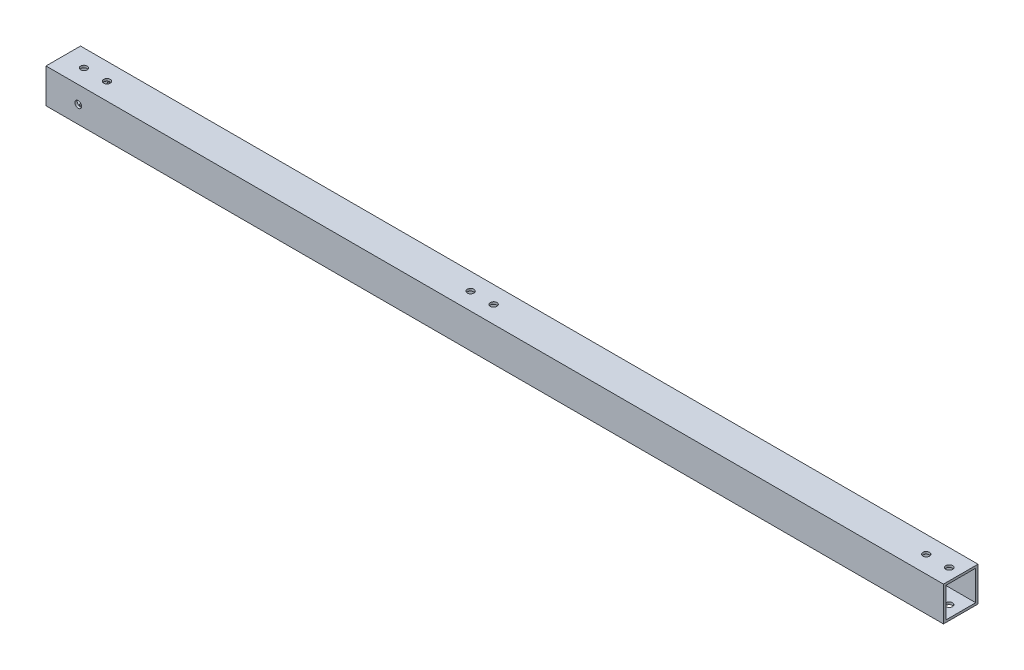
ISO-10303-21;
HEADER;
FILE_DESCRIPTION(('STEP AP214'),'2;1');
FILE_NAME('part.step','',(''),(''),'','','');
FILE_SCHEMA(('AUTOMOTIVE_DESIGN { 1 0 10303 214 1 1 1 1 }'));
ENDSEC;
DATA;
#1=APPLICATION_CONTEXT('core data for automotive mechanical design processes');
#2=APPLICATION_PROTOCOL_DEFINITION('international standard','automotive_design',2000,#1);
#3=PRODUCT_CONTEXT('',#1,'mechanical');
#4=PRODUCT('Part','Part','',(#3));
#5=PRODUCT_RELATED_PRODUCT_CATEGORY('part','',(#4));
#6=PRODUCT_DEFINITION_FORMATION('','',#4);
#7=PRODUCT_DEFINITION_CONTEXT('part definition',#1,'design');
#8=PRODUCT_DEFINITION('design','',#6,#7);
#9=PRODUCT_DEFINITION_SHAPE('','',#8);
#10=(LENGTH_UNIT() NAMED_UNIT(*) SI_UNIT(.MILLI.,.METRE.));
#11=(NAMED_UNIT(*) PLANE_ANGLE_UNIT() SI_UNIT($,.RADIAN.));
#12=(NAMED_UNIT(*) SI_UNIT($,.STERADIAN.) SOLID_ANGLE_UNIT());
#13=UNCERTAINTY_MEASURE_WITH_UNIT(LENGTH_MEASURE(1.E-05),#10,'distance_accuracy_value','');
#14=(GEOMETRIC_REPRESENTATION_CONTEXT(3) GLOBAL_UNCERTAINTY_ASSIGNED_CONTEXT((#13)) GLOBAL_UNIT_ASSIGNED_CONTEXT((#10,
#11,#12)) REPRESENTATION_CONTEXT('',''));
#15=CARTESIAN_POINT('',(0.,0.,0.));
#16=DIRECTION('',(0.,0.,1.));
#17=DIRECTION('',(1.,0.,0.));
#18=AXIS2_PLACEMENT_3D('',#15,#16,#17);
#19=CARTESIAN_POINT('',(390.,0.,0.));
#20=DIRECTION('',(-1.,0.,0.));
#21=DIRECTION('',(0.,0.,1.));
#22=AXIS2_PLACEMENT_3D('',#19,#20,#21);
#23=PLANE('',#22);
#24=DIRECTION('',(0.,1.,0.));
#25=VECTOR('',#24,1.);
#26=CARTESIAN_POINT('',(390.,-7.5,-7.5));
#27=LINE('',#26,#25);
#28=CARTESIAN_POINT('',(390.,-7.5,-7.5));
#29=VERTEX_POINT('',#28);
#30=CARTESIAN_POINT('',(390.,7.5,-7.5));
#31=VERTEX_POINT('',#30);
#32=EDGE_CURVE('E146',#29,#31,#27,.T.);
#33=ORIENTED_EDGE('',*,*,#32,.T.);
#34=DIRECTION('',(0.,0.,1.));
#35=VECTOR('',#34,1.);
#36=CARTESIAN_POINT('',(390.,7.5,7.5));
#37=LINE('',#36,#35);
#38=CARTESIAN_POINT('',(390.,7.5,7.5));
#39=VERTEX_POINT('',#38);
#40=EDGE_CURVE('E149',#31,#39,#37,.T.);
#41=ORIENTED_EDGE('',*,*,#40,.T.);
#42=DIRECTION('',(0.,-1.,0.));
#43=VECTOR('',#42,1.);
#44=CARTESIAN_POINT('',(390.,-7.5,7.5));
#45=LINE('',#44,#43);
#46=CARTESIAN_POINT('',(390.,-7.5,7.5));
#47=VERTEX_POINT('',#46);
#48=EDGE_CURVE('E152',#39,#47,#45,.T.);
#49=ORIENTED_EDGE('',*,*,#48,.T.);
#50=DIRECTION('',(0.,0.,-1.));
#51=VECTOR('',#50,1.);
#52=CARTESIAN_POINT('',(390.,-7.5,7.5));
#53=LINE('',#52,#51);
#54=EDGE_CURVE('E154',#47,#29,#53,.T.);
#55=ORIENTED_EDGE('',*,*,#54,.T.);
#56=EDGE_LOOP('',(#33,#41,#49,#55));
#57=FACE_BOUND('',#56,.T.);
#58=DIRECTION('',(0.,0.,-1.));
#59=VECTOR('',#58,1.);
#60=CARTESIAN_POINT('',(390.,-6.5,6.5));
#61=LINE('',#60,#59);
#62=CARTESIAN_POINT('',(390.,-6.5,6.5));
#63=VERTEX_POINT('',#62);
#64=CARTESIAN_POINT('',(390.,-6.5,-6.5));
#65=VERTEX_POINT('',#64);
#66=EDGE_CURVE('E108',#63,#65,#61,.T.);
#67=ORIENTED_EDGE('',*,*,#66,.F.);
#68=DIRECTION('',(0.,-1.,0.));
#69=VECTOR('',#68,1.);
#70=CARTESIAN_POINT('',(390.,-6.5,6.5));
#71=LINE('',#70,#69);
#72=CARTESIAN_POINT('',(390.,6.5,6.5));
#73=VERTEX_POINT('',#72);
#74=EDGE_CURVE('E130',#73,#63,#71,.T.);
#75=ORIENTED_EDGE('',*,*,#74,.F.);
#76=DIRECTION('',(0.,0.,1.));
#77=VECTOR('',#76,1.);
#78=CARTESIAN_POINT('',(390.,6.5,6.5));
#79=LINE('',#78,#77);
#80=CARTESIAN_POINT('',(390.,6.5,-6.5));
#81=VERTEX_POINT('',#80);
#82=EDGE_CURVE('E128',#81,#73,#79,.T.);
#83=ORIENTED_EDGE('',*,*,#82,.F.);
#84=DIRECTION('',(0.,1.,0.));
#85=VECTOR('',#84,1.);
#86=CARTESIAN_POINT('',(390.,-6.5,-6.5));
#87=LINE('',#86,#85);
#88=EDGE_CURVE('E116',#65,#81,#87,.T.);
#89=ORIENTED_EDGE('',*,*,#88,.F.);
#90=EDGE_LOOP('',(#67,#75,#83,#89));
#91=FACE_BOUND('',#90,.T.);
#92=ADVANCED_FACE('F41',(#57,#91),#23,.F.);
#93=CARTESIAN_POINT('',(0.,0.,0.));
#94=DIRECTION('',(-1.,0.,0.));
#95=DIRECTION('',(0.,0.,1.));
#96=AXIS2_PLACEMENT_3D('',#93,#94,#95);
#97=PLANE('',#96);
#98=DIRECTION('',(0.,1.,0.));
#99=VECTOR('',#98,1.);
#100=CARTESIAN_POINT('',(0.,-7.5,-7.5));
#101=LINE('',#100,#99);
#102=CARTESIAN_POINT('',(0.,-7.5,-7.5));
#103=VERTEX_POINT('',#102);
#104=CARTESIAN_POINT('',(0.,7.5,-7.5));
#105=VERTEX_POINT('',#104);
#106=EDGE_CURVE('E124',#103,#105,#101,.T.);
#107=ORIENTED_EDGE('',*,*,#106,.F.);
#108=DIRECTION('',(0.,0.,-1.));
#109=VECTOR('',#108,1.);
#110=CARTESIAN_POINT('',(0.,-7.5,7.5));
#111=LINE('',#110,#109);
#112=CARTESIAN_POINT('',(0.,-7.5,7.5));
#113=VERTEX_POINT('',#112);
#114=EDGE_CURVE('E150',#113,#103,#111,.T.);
#115=ORIENTED_EDGE('',*,*,#114,.F.);
#116=DIRECTION('',(0.,-1.,0.));
#117=VECTOR('',#116,1.);
#118=CARTESIAN_POINT('',(0.,-7.5,7.5));
#119=LINE('',#118,#117);
#120=CARTESIAN_POINT('',(0.,7.5,7.5));
#121=VERTEX_POINT('',#120);
#122=EDGE_CURVE('E161',#121,#113,#119,.T.);
#123=ORIENTED_EDGE('',*,*,#122,.F.);
#124=DIRECTION('',(0.,0.,1.));
#125=VECTOR('',#124,1.);
#126=CARTESIAN_POINT('',(0.,7.5,7.5));
#127=LINE('',#126,#125);
#128=EDGE_CURVE('E159',#105,#121,#127,.T.);
#129=ORIENTED_EDGE('',*,*,#128,.F.);
#130=EDGE_LOOP('',(#107,#115,#123,#129));
#131=FACE_BOUND('',#130,.T.);
#132=DIRECTION('',(0.,-1.,0.));
#133=VECTOR('',#132,1.);
#134=CARTESIAN_POINT('',(0.,-6.5,6.5));
#135=LINE('',#134,#133);
#136=CARTESIAN_POINT('',(0.,6.5,6.5));
#137=VERTEX_POINT('',#136);
#138=CARTESIAN_POINT('',(0.,-6.5,6.5));
#139=VERTEX_POINT('',#138);
#140=EDGE_CURVE('E117',#137,#139,#135,.T.);
#141=ORIENTED_EDGE('',*,*,#140,.T.);
#142=DIRECTION('',(0.,0.,-1.));
#143=VECTOR('',#142,1.);
#144=CARTESIAN_POINT('',(0.,-6.5,6.5));
#145=LINE('',#144,#143);
#146=CARTESIAN_POINT('',(0.,-6.5,-6.5));
#147=VERTEX_POINT('',#146);
#148=EDGE_CURVE('E66',#139,#147,#145,.T.);
#149=ORIENTED_EDGE('',*,*,#148,.T.);
#150=DIRECTION('',(0.,1.,0.));
#151=VECTOR('',#150,1.);
#152=CARTESIAN_POINT('',(0.,-6.5,-6.5));
#153=LINE('',#152,#151);
#154=CARTESIAN_POINT('',(0.,6.5,-6.5));
#155=VERTEX_POINT('',#154);
#156=EDGE_CURVE('E123',#147,#155,#153,.T.);
#157=ORIENTED_EDGE('',*,*,#156,.T.);
#158=DIRECTION('',(0.,0.,1.));
#159=VECTOR('',#158,1.);
#160=CARTESIAN_POINT('',(0.,6.5,6.5));
#161=LINE('',#160,#159);
#162=EDGE_CURVE('E138',#155,#137,#161,.T.);
#163=ORIENTED_EDGE('',*,*,#162,.T.);
#164=EDGE_LOOP('',(#141,#149,#157,#163));
#165=FACE_BOUND('',#164,.T.);
#166=ADVANCED_FACE('F267',(#131,#165),#97,.T.);
#167=CARTESIAN_POINT('',(390.,-7.5,-7.5));
#168=DIRECTION('',(0.,0.,1.));
#169=DIRECTION('',(1.,0.,0.));
#170=AXIS2_PLACEMENT_3D('',#167,#168,#169);
#171=PLANE('',#170);
#172=CARTESIAN_POINT('',(14.,0.,-7.5));
#173=DIRECTION('',(0.,0.,-1.));
#174=DIRECTION('',(-1.,0.,0.));
#175=AXIS2_PLACEMENT_3D('',#172,#173,#174);
#176=CIRCLE('',#175,1.45);
#177=CARTESIAN_POINT('',(12.55,0.,-7.5));
#178=VERTEX_POINT('',#177);
#179=EDGE_CURVE('E247',#178,#178,#176,.T.);
#180=ORIENTED_EDGE('',*,*,#179,.F.);
#181=EDGE_LOOP('',(#180));
#182=FACE_BOUND('',#181,.T.);
#183=ORIENTED_EDGE('',*,*,#106,.T.);
#184=DIRECTION('',(-1.,0.,0.));
#185=VECTOR('',#184,1.);
#186=CARTESIAN_POINT('',(390.,7.5,-7.5));
#187=LINE('',#186,#185);
#188=EDGE_CURVE('E11',#31,#105,#187,.T.);
#189=ORIENTED_EDGE('',*,*,#188,.F.);
#190=ORIENTED_EDGE('',*,*,#32,.F.);
#191=DIRECTION('',(-1.,0.,0.));
#192=VECTOR('',#191,1.);
#193=CARTESIAN_POINT('',(390.,-7.5,-7.5));
#194=LINE('',#193,#192);
#195=EDGE_CURVE('E156',#29,#103,#194,.T.);
#196=ORIENTED_EDGE('',*,*,#195,.T.);
#197=EDGE_LOOP('',(#183,#189,#190,#196));
#198=FACE_BOUND('',#197,.T.);
#199=ADVANCED_FACE('F43',(#182,#198),#171,.F.);
#200=CARTESIAN_POINT('',(390.,7.5,7.5));
#201=DIRECTION('',(0.,-1.,0.));
#202=DIRECTION('',(0.,0.,-1.));
#203=AXIS2_PLACEMENT_3D('',#200,#201,#202);
#204=PLANE('',#203);
#205=CARTESIAN_POINT('',(177.,7.5,0.));
#206=DIRECTION('',(0.,-1.,0.));
#207=DIRECTION('',(0.,0.,-1.));
#208=AXIS2_PLACEMENT_3D('',#205,#206,#207);
#209=CIRCLE('',#208,1.45);
#210=CARTESIAN_POINT('',(177.,7.5,-1.45));
#211=VERTEX_POINT('',#210);
#212=EDGE_CURVE('E227',#211,#211,#209,.T.);
#213=ORIENTED_EDGE('',*,*,#212,.T.);
#214=EDGE_LOOP('',(#213));
#215=FACE_BOUND('',#214,.T.);
#216=CARTESIAN_POINT('',(19.,7.5,0.));
#217=DIRECTION('',(0.,-1.,0.));
#218=DIRECTION('',(0.,0.,-1.));
#219=AXIS2_PLACEMENT_3D('',#216,#217,#218);
#220=CIRCLE('',#219,1.45);
#221=CARTESIAN_POINT('',(19.,7.5,-1.45000000000007));
#222=VERTEX_POINT('',#221);
#223=EDGE_CURVE('E234',#222,#222,#220,.T.);
#224=ORIENTED_EDGE('',*,*,#223,.T.);
#225=EDGE_LOOP('',(#224));
#226=FACE_BOUND('',#225,.T.);
#227=CARTESIAN_POINT('',(8.99999999999997,7.5,0.));
#228=DIRECTION('',(0.,-1.,0.));
#229=DIRECTION('',(0.,0.,-1.));
#230=AXIS2_PLACEMENT_3D('',#227,#228,#229);
#231=CIRCLE('',#230,1.45);
#232=CARTESIAN_POINT('',(8.99999999999997,7.5,-1.45000000000007));
#233=VERTEX_POINT('',#232);
#234=EDGE_CURVE('E215',#233,#233,#231,.T.);
#235=ORIENTED_EDGE('',*,*,#234,.T.);
#236=EDGE_LOOP('',(#235));
#237=FACE_BOUND('',#236,.T.);
#238=CARTESIAN_POINT('',(385.,7.5,0.));
#239=DIRECTION('',(0.,-1.,0.));
#240=DIRECTION('',(0.,0.,-1.));
#241=AXIS2_PLACEMENT_3D('',#238,#239,#240);
#242=CIRCLE('',#241,1.45);
#243=CARTESIAN_POINT('',(385.,7.5,-1.45000000000003));
#244=VERTEX_POINT('',#243);
#245=EDGE_CURVE('E222',#244,#244,#242,.T.);
#246=ORIENTED_EDGE('',*,*,#245,.T.);
#247=EDGE_LOOP('',(#246));
#248=FACE_BOUND('',#247,.T.);
#249=CARTESIAN_POINT('',(187.,7.5,0.));
#250=DIRECTION('',(0.,-1.,0.));
#251=DIRECTION('',(0.,0.,-1.));
#252=AXIS2_PLACEMENT_3D('',#249,#250,#251);
#253=CIRCLE('',#252,1.45);
#254=CARTESIAN_POINT('',(187.,7.5,-1.45));
#255=VERTEX_POINT('',#254);
#256=EDGE_CURVE('E239',#255,#255,#253,.T.);
#257=ORIENTED_EDGE('',*,*,#256,.T.);
#258=EDGE_LOOP('',(#257));
#259=FACE_BOUND('',#258,.T.);
#260=CARTESIAN_POINT('',(375.,7.5,0.));
#261=DIRECTION('',(0.,-1.,0.));
#262=DIRECTION('',(0.,0.,-1.));
#263=AXIS2_PLACEMENT_3D('',#260,#261,#262);
#264=CIRCLE('',#263,1.45);
#265=CARTESIAN_POINT('',(375.,7.5,-1.45000000000003));
#266=VERTEX_POINT('',#265);
#267=EDGE_CURVE('E175',#266,#266,#264,.T.);
#268=ORIENTED_EDGE('',*,*,#267,.T.);
#269=EDGE_LOOP('',(#268));
#270=FACE_BOUND('',#269,.T.);
#271=ORIENTED_EDGE('',*,*,#128,.T.);
#272=DIRECTION('',(-1.,0.,0.));
#273=VECTOR('',#272,1.);
#274=CARTESIAN_POINT('',(390.,7.5,7.5));
#275=LINE('',#274,#273);
#276=EDGE_CURVE('E50',#39,#121,#275,.T.);
#277=ORIENTED_EDGE('',*,*,#276,.F.);
#278=ORIENTED_EDGE('',*,*,#40,.F.);
#279=ORIENTED_EDGE('',*,*,#188,.T.);
#280=EDGE_LOOP('',(#271,#277,#278,#279));
#281=FACE_BOUND('',#280,.T.);
#282=ADVANCED_FACE('F296',(#215,#226,#237,#248,#259,#270,#281),#204,.F.);
#283=CARTESIAN_POINT('',(390.,-7.5,7.5));
#284=DIRECTION('',(0.,0.,-1.));
#285=DIRECTION('',(-1.,0.,0.));
#286=AXIS2_PLACEMENT_3D('',#283,#284,#285);
#287=PLANE('',#286);
#288=CARTESIAN_POINT('',(14.,0.,7.5));
#289=DIRECTION('',(0.,0.,-1.));
#290=DIRECTION('',(-1.,0.,0.));
#291=AXIS2_PLACEMENT_3D('',#288,#289,#290);
#292=CIRCLE('',#291,1.45);
#293=CARTESIAN_POINT('',(12.55,0.,7.5));
#294=VERTEX_POINT('',#293);
#295=EDGE_CURVE('E250',#294,#294,#292,.T.);
#296=ORIENTED_EDGE('',*,*,#295,.T.);
#297=EDGE_LOOP('',(#296));
#298=FACE_BOUND('',#297,.T.);
#299=ORIENTED_EDGE('',*,*,#122,.T.);
#300=DIRECTION('',(-1.,0.,0.));
#301=VECTOR('',#300,1.);
#302=CARTESIAN_POINT('',(390.,-7.5,7.5));
#303=LINE('',#302,#301);
#304=EDGE_CURVE('E166',#47,#113,#303,.T.);
#305=ORIENTED_EDGE('',*,*,#304,.F.);
#306=ORIENTED_EDGE('',*,*,#48,.F.);
#307=ORIENTED_EDGE('',*,*,#276,.T.);
#308=EDGE_LOOP('',(#299,#305,#306,#307));
#309=FACE_BOUND('',#308,.T.);
#310=ADVANCED_FACE('F293',(#298,#309),#287,.F.);
#311=CARTESIAN_POINT('',(390.,-7.5,7.5));
#312=DIRECTION('',(0.,1.,0.));
#313=DIRECTION('',(0.,0.,1.));
#314=AXIS2_PLACEMENT_3D('',#311,#312,#313);
#315=PLANE('',#314);
#316=CARTESIAN_POINT('',(177.,-7.5,0.));
#317=DIRECTION('',(0.,-1.,0.));
#318=DIRECTION('',(0.,0.,-1.));
#319=AXIS2_PLACEMENT_3D('',#316,#317,#318);
#320=CIRCLE('',#319,1.45);
#321=CARTESIAN_POINT('',(177.,-7.5,-1.45));
#322=VERTEX_POINT('',#321);
#323=EDGE_CURVE('E230',#322,#322,#320,.T.);
#324=ORIENTED_EDGE('',*,*,#323,.F.);
#325=EDGE_LOOP('',(#324));
#326=FACE_BOUND('',#325,.T.);
#327=CARTESIAN_POINT('',(19.,-7.5,0.));
#328=DIRECTION('',(0.,-1.,0.));
#329=DIRECTION('',(0.,0.,-1.));
#330=AXIS2_PLACEMENT_3D('',#327,#328,#329);
#331=CIRCLE('',#330,1.45);
#332=CARTESIAN_POINT('',(19.,-7.5,-1.45000000000007));
#333=VERTEX_POINT('',#332);
#334=EDGE_CURVE('E219',#333,#333,#331,.T.);
#335=ORIENTED_EDGE('',*,*,#334,.F.);
#336=EDGE_LOOP('',(#335));
#337=FACE_BOUND('',#336,.T.);
#338=CARTESIAN_POINT('',(8.99999999999997,-7.5,0.));
#339=DIRECTION('',(0.,-1.,0.));
#340=DIRECTION('',(0.,0.,-1.));
#341=AXIS2_PLACEMENT_3D('',#338,#339,#340);
#342=CIRCLE('',#341,1.45);
#343=CARTESIAN_POINT('',(8.99999999999997,-7.5,-1.45000000000007));
#344=VERTEX_POINT('',#343);
#345=EDGE_CURVE('E218',#344,#344,#342,.T.);
#346=ORIENTED_EDGE('',*,*,#345,.F.);
#347=EDGE_LOOP('',(#346));
#348=FACE_BOUND('',#347,.T.);
#349=CARTESIAN_POINT('',(385.,-7.5,0.));
#350=DIRECTION('',(0.,-1.,0.));
#351=DIRECTION('',(0.,0.,-1.));
#352=AXIS2_PLACEMENT_3D('',#349,#350,#351);
#353=CIRCLE('',#352,1.45);
#354=CARTESIAN_POINT('',(385.,-7.5,-1.45000000000003));
#355=VERTEX_POINT('',#354);
#356=EDGE_CURVE('E212',#355,#355,#353,.T.);
#357=ORIENTED_EDGE('',*,*,#356,.F.);
#358=EDGE_LOOP('',(#357));
#359=FACE_BOUND('',#358,.T.);
#360=CARTESIAN_POINT('',(187.,-7.5,0.));
#361=DIRECTION('',(0.,-1.,0.));
#362=DIRECTION('',(0.,0.,-1.));
#363=AXIS2_PLACEMENT_3D('',#360,#361,#362);
#364=CIRCLE('',#363,1.45);
#365=CARTESIAN_POINT('',(187.,-7.5,-1.45));
#366=VERTEX_POINT('',#365);
#367=EDGE_CURVE('E231',#366,#366,#364,.T.);
#368=ORIENTED_EDGE('',*,*,#367,.F.);
#369=EDGE_LOOP('',(#368));
#370=FACE_BOUND('',#369,.T.);
#371=CARTESIAN_POINT('',(375.,-7.5,0.));
#372=DIRECTION('',(0.,-1.,0.));
#373=DIRECTION('',(0.,0.,-1.));
#374=AXIS2_PLACEMENT_3D('',#371,#372,#373);
#375=CIRCLE('',#374,1.45);
#376=CARTESIAN_POINT('',(375.,-7.5,-1.45000000000003));
#377=VERTEX_POINT('',#376);
#378=EDGE_CURVE('E209',#377,#377,#375,.T.);
#379=ORIENTED_EDGE('',*,*,#378,.F.);
#380=EDGE_LOOP('',(#379));
#381=FACE_BOUND('',#380,.T.);
#382=ORIENTED_EDGE('',*,*,#114,.T.);
#383=ORIENTED_EDGE('',*,*,#195,.F.);
#384=ORIENTED_EDGE('',*,*,#54,.F.);
#385=ORIENTED_EDGE('',*,*,#304,.T.);
#386=EDGE_LOOP('',(#382,#383,#384,#385));
#387=FACE_BOUND('',#386,.T.);
#388=ADVANCED_FACE('F290',(#326,#337,#348,#359,#370,#381,#387),#315,.F.);
#389=CARTESIAN_POINT('',(390.,-6.5,6.5));
#390=DIRECTION('',(0.,1.,0.));
#391=DIRECTION('',(0.,0.,1.));
#392=AXIS2_PLACEMENT_3D('',#389,#390,#391);
#393=PLANE('',#392);
#394=CARTESIAN_POINT('',(177.,-6.5,0.));
#395=DIRECTION('',(0.,1.,0.));
#396=DIRECTION('',(0.,0.,1.));
#397=AXIS2_PLACEMENT_3D('',#394,#395,#396);
#398=CIRCLE('',#397,1.45);
#399=CARTESIAN_POINT('',(177.,-6.5,1.45));
#400=VERTEX_POINT('',#399);
#401=EDGE_CURVE('E136',#400,#400,#398,.T.);
#402=ORIENTED_EDGE('',*,*,#401,.F.);
#403=EDGE_LOOP('',(#402));
#404=FACE_BOUND('',#403,.T.);
#405=CARTESIAN_POINT('',(19.,-6.5,0.));
#406=DIRECTION('',(0.,1.,0.));
#407=DIRECTION('',(0.,0.,1.));
#408=AXIS2_PLACEMENT_3D('',#405,#406,#407);
#409=CIRCLE('',#408,1.45);
#410=CARTESIAN_POINT('',(19.,-6.5,1.44999999999993));
#411=VERTEX_POINT('',#410);
#412=EDGE_CURVE('E190',#411,#411,#409,.T.);
#413=ORIENTED_EDGE('',*,*,#412,.F.);
#414=EDGE_LOOP('',(#413));
#415=FACE_BOUND('',#414,.T.);
#416=CARTESIAN_POINT('',(8.99999999999997,-6.5,0.));
#417=DIRECTION('',(0.,1.,0.));
#418=DIRECTION('',(0.,0.,1.));
#419=AXIS2_PLACEMENT_3D('',#416,#417,#418);
#420=CIRCLE('',#419,1.45);
#421=CARTESIAN_POINT('',(8.99999999999997,-6.5,1.44999999999993));
#422=VERTEX_POINT('',#421);
#423=EDGE_CURVE('E187',#422,#422,#420,.T.);
#424=ORIENTED_EDGE('',*,*,#423,.F.);
#425=EDGE_LOOP('',(#424));
#426=FACE_BOUND('',#425,.T.);
#427=CARTESIAN_POINT('',(385.,-6.5,0.));
#428=DIRECTION('',(0.,1.,0.));
#429=DIRECTION('',(0.,0.,1.));
#430=AXIS2_PLACEMENT_3D('',#427,#428,#429);
#431=CIRCLE('',#430,1.45);
#432=CARTESIAN_POINT('',(385.,-6.5,1.44999999999997));
#433=VERTEX_POINT('',#432);
#434=EDGE_CURVE('E183',#433,#433,#431,.T.);
#435=ORIENTED_EDGE('',*,*,#434,.F.);
#436=EDGE_LOOP('',(#435));
#437=FACE_BOUND('',#436,.T.);
#438=CARTESIAN_POINT('',(187.,-6.5,0.));
#439=DIRECTION('',(0.,1.,0.));
#440=DIRECTION('',(0.,0.,1.));
#441=AXIS2_PLACEMENT_3D('',#438,#439,#440);
#442=CIRCLE('',#441,1.45);
#443=CARTESIAN_POINT('',(187.,-6.5,1.45));
#444=VERTEX_POINT('',#443);
#445=EDGE_CURVE('E179',#444,#444,#442,.T.);
#446=ORIENTED_EDGE('',*,*,#445,.F.);
#447=EDGE_LOOP('',(#446));
#448=FACE_BOUND('',#447,.T.);
#449=CARTESIAN_POINT('',(375.,-6.5,0.));
#450=DIRECTION('',(0.,1.,0.));
#451=DIRECTION('',(0.,0.,1.));
#452=AXIS2_PLACEMENT_3D('',#449,#450,#451);
#453=CIRCLE('',#452,1.45);
#454=CARTESIAN_POINT('',(375.,-6.5,1.44999999999997));
#455=VERTEX_POINT('',#454);
#456=EDGE_CURVE('E174',#455,#455,#453,.T.);
#457=ORIENTED_EDGE('',*,*,#456,.F.);
#458=EDGE_LOOP('',(#457));
#459=FACE_BOUND('',#458,.T.);
#460=ORIENTED_EDGE('',*,*,#148,.F.);
#461=DIRECTION('',(-1.,0.,0.));
#462=VECTOR('',#461,1.);
#463=CARTESIAN_POINT('',(390.,-6.5,6.5));
#464=LINE('',#463,#462);
#465=EDGE_CURVE('E112',#63,#139,#464,.T.);
#466=ORIENTED_EDGE('',*,*,#465,.F.);
#467=ORIENTED_EDGE('',*,*,#66,.T.);
#468=DIRECTION('',(-1.,0.,0.));
#469=VECTOR('',#468,1.);
#470=CARTESIAN_POINT('',(390.,-6.5,-6.5));
#471=LINE('',#470,#469);
#472=EDGE_CURVE('E111',#65,#147,#471,.T.);
#473=ORIENTED_EDGE('',*,*,#472,.T.);
#474=EDGE_LOOP('',(#460,#466,#467,#473));
#475=FACE_BOUND('',#474,.T.);
#476=ADVANCED_FACE('F110',(#404,#415,#426,#437,#448,#459,#475),#393,.T.);
#477=CARTESIAN_POINT('',(390.,-6.5,-6.5));
#478=DIRECTION('',(0.,0.,1.));
#479=DIRECTION('',(0.,-1.,0.));
#480=AXIS2_PLACEMENT_3D('',#477,#478,#479);
#481=PLANE('',#480);
#482=CARTESIAN_POINT('',(14.,0.,-6.5));
#483=DIRECTION('',(0.,0.,1.));
#484=DIRECTION('',(0.,-1.,0.));
#485=AXIS2_PLACEMENT_3D('',#482,#483,#484);
#486=CIRCLE('',#485,1.45);
#487=CARTESIAN_POINT('',(14.,-1.44999999999999,-6.5));
#488=VERTEX_POINT('',#487);
#489=EDGE_CURVE('E242',#488,#488,#486,.T.);
#490=ORIENTED_EDGE('',*,*,#489,.F.);
#491=EDGE_LOOP('',(#490));
#492=FACE_BOUND('',#491,.T.);
#493=ORIENTED_EDGE('',*,*,#156,.F.);
#494=ORIENTED_EDGE('',*,*,#472,.F.);
#495=ORIENTED_EDGE('',*,*,#88,.T.);
#496=DIRECTION('',(-1.,0.,0.));
#497=VECTOR('',#496,1.);
#498=CARTESIAN_POINT('',(390.,6.5,-6.5));
#499=LINE('',#498,#497);
#500=EDGE_CURVE('E125',#81,#155,#499,.T.);
#501=ORIENTED_EDGE('',*,*,#500,.T.);
#502=EDGE_LOOP('',(#493,#494,#495,#501));
#503=FACE_BOUND('',#502,.T.);
#504=ADVANCED_FACE('F120',(#492,#503),#481,.T.);
#505=CARTESIAN_POINT('',(390.,6.5,6.5));
#506=DIRECTION('',(0.,-1.,0.));
#507=DIRECTION('',(0.,0.,-1.));
#508=AXIS2_PLACEMENT_3D('',#505,#506,#507);
#509=PLANE('',#508);
#510=CARTESIAN_POINT('',(177.,6.5,0.));
#511=DIRECTION('',(0.,-1.,0.));
#512=DIRECTION('',(0.,0.,-1.));
#513=AXIS2_PLACEMENT_3D('',#510,#511,#512);
#514=CIRCLE('',#513,1.45);
#515=CARTESIAN_POINT('',(177.,6.5,-1.45));
#516=VERTEX_POINT('',#515);
#517=EDGE_CURVE('E191',#516,#516,#514,.T.);
#518=ORIENTED_EDGE('',*,*,#517,.F.);
#519=EDGE_LOOP('',(#518));
#520=FACE_BOUND('',#519,.T.);
#521=CARTESIAN_POINT('',(19.,6.5,0.));
#522=DIRECTION('',(0.,-1.,0.));
#523=DIRECTION('',(0.,0.,-1.));
#524=AXIS2_PLACEMENT_3D('',#521,#522,#523);
#525=CIRCLE('',#524,1.45);
#526=CARTESIAN_POINT('',(19.,6.5,-1.45000000000007));
#527=VERTEX_POINT('',#526);
#528=EDGE_CURVE('E188',#527,#527,#525,.T.);
#529=ORIENTED_EDGE('',*,*,#528,.F.);
#530=EDGE_LOOP('',(#529));
#531=FACE_BOUND('',#530,.T.);
#532=CARTESIAN_POINT('',(8.99999999999997,6.5,0.));
#533=DIRECTION('',(0.,-1.,0.));
#534=DIRECTION('',(0.,0.,-1.));
#535=AXIS2_PLACEMENT_3D('',#532,#533,#534);
#536=CIRCLE('',#535,1.45);
#537=CARTESIAN_POINT('',(8.99999999999997,6.5,-1.45000000000007));
#538=VERTEX_POINT('',#537);
#539=EDGE_CURVE('E184',#538,#538,#536,.T.);
#540=ORIENTED_EDGE('',*,*,#539,.F.);
#541=EDGE_LOOP('',(#540));
#542=FACE_BOUND('',#541,.T.);
#543=CARTESIAN_POINT('',(385.,6.5,0.));
#544=DIRECTION('',(0.,-1.,0.));
#545=DIRECTION('',(0.,0.,-1.));
#546=AXIS2_PLACEMENT_3D('',#543,#544,#545);
#547=CIRCLE('',#546,1.45);
#548=CARTESIAN_POINT('',(385.,6.5,-1.45000000000003));
#549=VERTEX_POINT('',#548);
#550=EDGE_CURVE('E180',#549,#549,#547,.T.);
#551=ORIENTED_EDGE('',*,*,#550,.F.);
#552=EDGE_LOOP('',(#551));
#553=FACE_BOUND('',#552,.T.);
#554=CARTESIAN_POINT('',(187.,6.5,0.));
#555=DIRECTION('',(0.,-1.,0.));
#556=DIRECTION('',(0.,0.,-1.));
#557=AXIS2_PLACEMENT_3D('',#554,#555,#556);
#558=CIRCLE('',#557,1.45);
#559=CARTESIAN_POINT('',(187.,6.5,-1.45));
#560=VERTEX_POINT('',#559);
#561=EDGE_CURVE('E176',#560,#560,#558,.T.);
#562=ORIENTED_EDGE('',*,*,#561,.F.);
#563=EDGE_LOOP('',(#562));
#564=FACE_BOUND('',#563,.T.);
#565=CARTESIAN_POINT('',(375.,6.5,0.));
#566=DIRECTION('',(0.,-1.,0.));
#567=DIRECTION('',(0.,0.,-1.));
#568=AXIS2_PLACEMENT_3D('',#565,#566,#567);
#569=CIRCLE('',#568,1.45);
#570=CARTESIAN_POINT('',(375.,6.5,-1.45000000000003));
#571=VERTEX_POINT('',#570);
#572=EDGE_CURVE('E171',#571,#571,#569,.T.);
#573=ORIENTED_EDGE('',*,*,#572,.F.);
#574=EDGE_LOOP('',(#573));
#575=FACE_BOUND('',#574,.T.);
#576=ORIENTED_EDGE('',*,*,#162,.F.);
#577=ORIENTED_EDGE('',*,*,#500,.F.);
#578=ORIENTED_EDGE('',*,*,#82,.T.);
#579=DIRECTION('',(-1.,0.,0.));
#580=VECTOR('',#579,1.);
#581=CARTESIAN_POINT('',(390.,6.5,6.5));
#582=LINE('',#581,#580);
#583=EDGE_CURVE('E58',#73,#137,#582,.T.);
#584=ORIENTED_EDGE('',*,*,#583,.T.);
#585=EDGE_LOOP('',(#576,#577,#578,#584));
#586=FACE_BOUND('',#585,.T.);
#587=ADVANCED_FACE('F263',(#520,#531,#542,#553,#564,#575,#586),#509,.T.);
#588=CARTESIAN_POINT('',(390.,-6.5,6.5));
#589=DIRECTION('',(0.,0.,-1.));
#590=DIRECTION('',(-1.,0.,0.));
#591=AXIS2_PLACEMENT_3D('',#588,#589,#590);
#592=PLANE('',#591);
#593=CARTESIAN_POINT('',(14.,0.,6.5));
#594=DIRECTION('',(0.,0.,-1.));
#595=DIRECTION('',(-1.,0.,0.));
#596=AXIS2_PLACEMENT_3D('',#593,#594,#595);
#597=CIRCLE('',#596,1.45);
#598=CARTESIAN_POINT('',(12.55,0.,6.5));
#599=VERTEX_POINT('',#598);
#600=EDGE_CURVE('E45',#599,#599,#597,.T.);
#601=ORIENTED_EDGE('',*,*,#600,.F.);
#602=EDGE_LOOP('',(#601));
#603=FACE_BOUND('',#602,.T.);
#604=ORIENTED_EDGE('',*,*,#140,.F.);
#605=ORIENTED_EDGE('',*,*,#583,.F.);
#606=ORIENTED_EDGE('',*,*,#74,.T.);
#607=ORIENTED_EDGE('',*,*,#465,.T.);
#608=EDGE_LOOP('',(#604,#605,#606,#607));
#609=FACE_BOUND('',#608,.T.);
#610=ADVANCED_FACE('F260',(#603,#609),#592,.T.);
#611=CARTESIAN_POINT('',(375.,7.5,0.));
#612=DIRECTION('',(0.,-1.,0.));
#613=DIRECTION('',(0.,0.,-1.));
#614=AXIS2_PLACEMENT_3D('',#611,#612,#613);
#615=CYLINDRICAL_SURFACE('',#614,1.45);
#616=ORIENTED_EDGE('',*,*,#572,.T.);
#617=EDGE_LOOP('',(#616));
#618=FACE_BOUND('',#617,.T.);
#619=ORIENTED_EDGE('',*,*,#267,.F.);
#620=EDGE_LOOP('',(#619));
#621=FACE_BOUND('',#620,.T.);
#622=ADVANCED_FACE('F262',(#618,#621),#615,.F.);
#623=CARTESIAN_POINT('',(187.,7.5,0.));
#624=DIRECTION('',(0.,-1.,0.));
#625=DIRECTION('',(0.,0.,-1.));
#626=AXIS2_PLACEMENT_3D('',#623,#624,#625);
#627=CYLINDRICAL_SURFACE('',#626,1.45);
#628=ORIENTED_EDGE('',*,*,#561,.T.);
#629=EDGE_LOOP('',(#628));
#630=FACE_BOUND('',#629,.T.);
#631=ORIENTED_EDGE('',*,*,#256,.F.);
#632=EDGE_LOOP('',(#631));
#633=FACE_BOUND('',#632,.T.);
#634=ADVANCED_FACE('F329',(#630,#633),#627,.F.);
#635=CARTESIAN_POINT('',(385.,7.5,0.));
#636=DIRECTION('',(0.,-1.,0.));
#637=DIRECTION('',(0.,0.,-1.));
#638=AXIS2_PLACEMENT_3D('',#635,#636,#637);
#639=CYLINDRICAL_SURFACE('',#638,1.45);
#640=ORIENTED_EDGE('',*,*,#550,.T.);
#641=EDGE_LOOP('',(#640));
#642=FACE_BOUND('',#641,.T.);
#643=ORIENTED_EDGE('',*,*,#245,.F.);
#644=EDGE_LOOP('',(#643));
#645=FACE_BOUND('',#644,.T.);
#646=ADVANCED_FACE('F336',(#642,#645),#639,.F.);
#647=CARTESIAN_POINT('',(8.99999999999997,7.5,0.));
#648=DIRECTION('',(0.,-1.,0.));
#649=DIRECTION('',(0.,0.,-1.));
#650=AXIS2_PLACEMENT_3D('',#647,#648,#649);
#651=CYLINDRICAL_SURFACE('',#650,1.45);
#652=ORIENTED_EDGE('',*,*,#539,.T.);
#653=EDGE_LOOP('',(#652));
#654=FACE_BOUND('',#653,.T.);
#655=ORIENTED_EDGE('',*,*,#234,.F.);
#656=EDGE_LOOP('',(#655));
#657=FACE_BOUND('',#656,.T.);
#658=ADVANCED_FACE('F384',(#654,#657),#651,.F.);
#659=CARTESIAN_POINT('',(19.,7.5,0.));
#660=DIRECTION('',(0.,-1.,0.));
#661=DIRECTION('',(0.,0.,-1.));
#662=AXIS2_PLACEMENT_3D('',#659,#660,#661);
#663=CYLINDRICAL_SURFACE('',#662,1.45);
#664=ORIENTED_EDGE('',*,*,#528,.T.);
#665=EDGE_LOOP('',(#664));
#666=FACE_BOUND('',#665,.T.);
#667=ORIENTED_EDGE('',*,*,#223,.F.);
#668=EDGE_LOOP('',(#667));
#669=FACE_BOUND('',#668,.T.);
#670=ADVANCED_FACE('F350',(#666,#669),#663,.F.);
#671=CARTESIAN_POINT('',(177.,7.5,0.));
#672=DIRECTION('',(0.,-1.,0.));
#673=DIRECTION('',(0.,0.,-1.));
#674=AXIS2_PLACEMENT_3D('',#671,#672,#673);
#675=CYLINDRICAL_SURFACE('',#674,1.45);
#676=ORIENTED_EDGE('',*,*,#517,.T.);
#677=EDGE_LOOP('',(#676));
#678=FACE_BOUND('',#677,.T.);
#679=ORIENTED_EDGE('',*,*,#212,.F.);
#680=EDGE_LOOP('',(#679));
#681=FACE_BOUND('',#680,.T.);
#682=ADVANCED_FACE('F342',(#678,#681),#675,.F.);
#683=ORIENTED_EDGE('',*,*,#456,.T.);
#684=EDGE_LOOP('',(#683));
#685=FACE_BOUND('',#684,.T.);
#686=ORIENTED_EDGE('',*,*,#378,.T.);
#687=EDGE_LOOP('',(#686));
#688=FACE_BOUND('',#687,.T.);
#689=ADVANCED_FACE('F332',(#685,#688),#615,.F.);
#690=ORIENTED_EDGE('',*,*,#445,.T.);
#691=EDGE_LOOP('',(#690));
#692=FACE_BOUND('',#691,.T.);
#693=ORIENTED_EDGE('',*,*,#367,.T.);
#694=EDGE_LOOP('',(#693));
#695=FACE_BOUND('',#694,.T.);
#696=ADVANCED_FACE('F339',(#692,#695),#627,.F.);
#697=ORIENTED_EDGE('',*,*,#434,.T.);
#698=EDGE_LOOP('',(#697));
#699=FACE_BOUND('',#698,.T.);
#700=ORIENTED_EDGE('',*,*,#356,.T.);
#701=EDGE_LOOP('',(#700));
#702=FACE_BOUND('',#701,.T.);
#703=ADVANCED_FACE('F348',(#699,#702),#639,.F.);
#704=ORIENTED_EDGE('',*,*,#423,.T.);
#705=EDGE_LOOP('',(#704));
#706=FACE_BOUND('',#705,.T.);
#707=ORIENTED_EDGE('',*,*,#345,.T.);
#708=EDGE_LOOP('',(#707));
#709=FACE_BOUND('',#708,.T.);
#710=ADVANCED_FACE('F375',(#706,#709),#651,.F.);
#711=ORIENTED_EDGE('',*,*,#412,.T.);
#712=EDGE_LOOP('',(#711));
#713=FACE_BOUND('',#712,.T.);
#714=ORIENTED_EDGE('',*,*,#334,.T.);
#715=EDGE_LOOP('',(#714));
#716=FACE_BOUND('',#715,.T.);
#717=ADVANCED_FACE('F382',(#713,#716),#663,.F.);
#718=ORIENTED_EDGE('',*,*,#401,.T.);
#719=EDGE_LOOP('',(#718));
#720=FACE_BOUND('',#719,.T.);
#721=ORIENTED_EDGE('',*,*,#323,.T.);
#722=EDGE_LOOP('',(#721));
#723=FACE_BOUND('',#722,.T.);
#724=ADVANCED_FACE('F352',(#720,#723),#675,.F.);
#725=CARTESIAN_POINT('',(14.,0.,7.5));
#726=DIRECTION('',(0.,0.,-1.));
#727=DIRECTION('',(-1.,0.,0.));
#728=AXIS2_PLACEMENT_3D('',#725,#726,#727);
#729=CYLINDRICAL_SURFACE('',#728,1.45);
#730=ORIENTED_EDGE('',*,*,#600,.T.);
#731=EDGE_LOOP('',(#730));
#732=FACE_BOUND('',#731,.T.);
#733=ORIENTED_EDGE('',*,*,#295,.F.);
#734=EDGE_LOOP('',(#733));
#735=FACE_BOUND('',#734,.T.);
#736=ADVANCED_FACE('F257',(#732,#735),#729,.F.);
#737=ORIENTED_EDGE('',*,*,#489,.T.);
#738=EDGE_LOOP('',(#737));
#739=FACE_BOUND('',#738,.T.);
#740=ORIENTED_EDGE('',*,*,#179,.T.);
#741=EDGE_LOOP('',(#740));
#742=FACE_BOUND('',#741,.T.);
#743=ADVANCED_FACE('F424',(#739,#742),#729,.F.);
#744=CLOSED_SHELL('',(#92,#166,#199,#282,#310,#388,#476,#504,#587,#610,#622,#634,#646,#658,#670,
#682,#689,#696,#703,#710,#717,#724,#736,#743));
#745=MANIFOLD_SOLID_BREP('B2',#744);
#746=ADVANCED_BREP_SHAPE_REPRESENTATION('',(#18,#745),#14);
#747=SHAPE_DEFINITION_REPRESENTATION(#9,#746);
ENDSEC;
END-ISO-10303-21;
